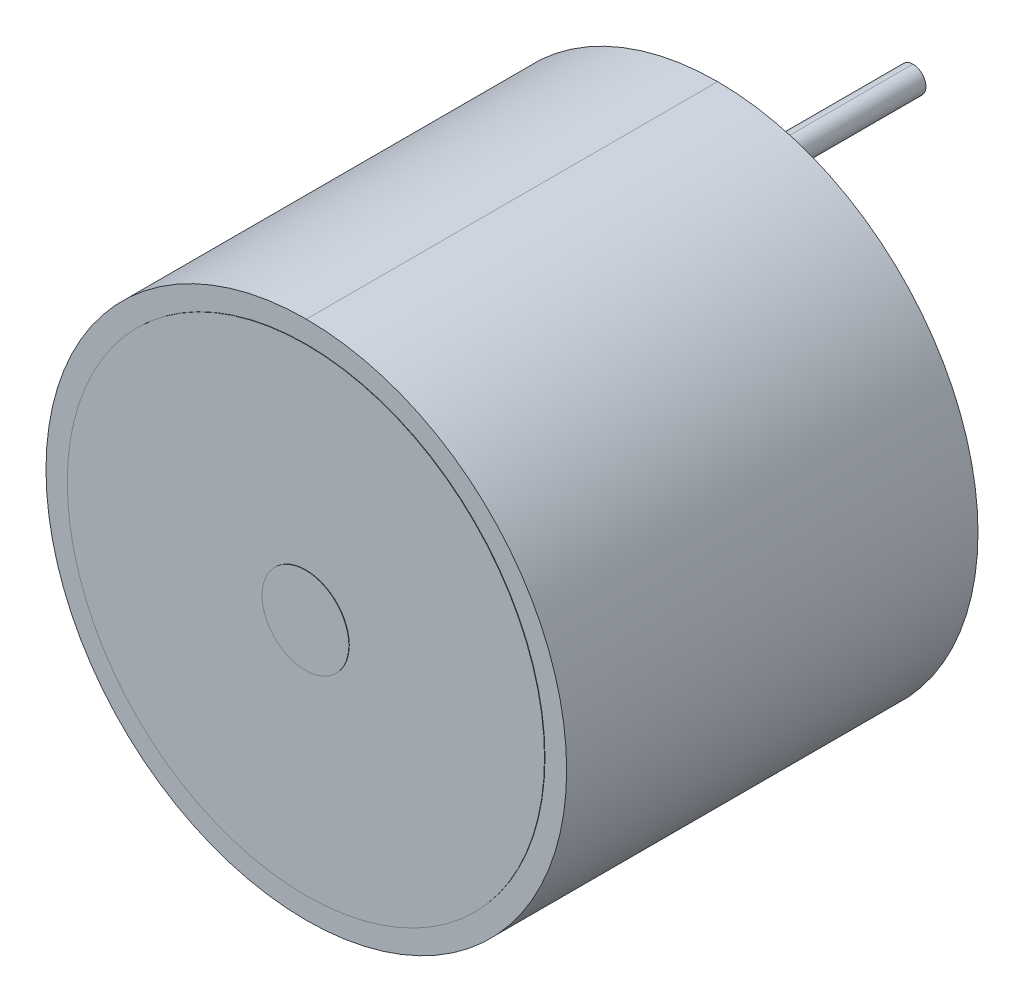
ISO-10303-21;
HEADER;
FILE_DESCRIPTION(('STEP AP214'),'2;1');
FILE_NAME('part.step','',(''),(''),'','','');
FILE_SCHEMA(('AUTOMOTIVE_DESIGN { 1 0 10303 214 1 1 1 1 }'));
ENDSEC;
DATA;
#1=APPLICATION_CONTEXT('core data for automotive mechanical design processes');
#2=APPLICATION_PROTOCOL_DEFINITION('international standard','automotive_design',2000,#1);
#3=PRODUCT_CONTEXT('',#1,'mechanical');
#4=PRODUCT('Part','Part','',(#3));
#5=PRODUCT_RELATED_PRODUCT_CATEGORY('part','',(#4));
#6=PRODUCT_DEFINITION_FORMATION('','',#4);
#7=PRODUCT_DEFINITION_CONTEXT('part definition',#1,'design');
#8=PRODUCT_DEFINITION('design','',#6,#7);
#9=PRODUCT_DEFINITION_SHAPE('','',#8);
#10=(LENGTH_UNIT() NAMED_UNIT(*) SI_UNIT(.MILLI.,.METRE.));
#11=(NAMED_UNIT(*) PLANE_ANGLE_UNIT() SI_UNIT($,.RADIAN.));
#12=(NAMED_UNIT(*) SI_UNIT($,.STERADIAN.) SOLID_ANGLE_UNIT());
#13=UNCERTAINTY_MEASURE_WITH_UNIT(LENGTH_MEASURE(1.E-05),#10,'distance_accuracy_value','');
#14=(GEOMETRIC_REPRESENTATION_CONTEXT(3) GLOBAL_UNCERTAINTY_ASSIGNED_CONTEXT((#13)) GLOBAL_UNIT_ASSIGNED_CONTEXT((#10,
#11,#12)) REPRESENTATION_CONTEXT('',''));
#15=CARTESIAN_POINT('',(0.,0.,0.));
#16=DIRECTION('',(0.,0.,1.));
#17=DIRECTION('',(1.,0.,0.));
#18=AXIS2_PLACEMENT_3D('',#15,#16,#17);
#19=CARTESIAN_POINT('',(0.,0.,0.02));
#20=DIRECTION('',(0.,0.,-1.));
#21=DIRECTION('',(1.,0.,0.));
#22=AXIS2_PLACEMENT_3D('',#19,#20,#21);
#23=CYLINDRICAL_SURFACE('',#22,5.5);
#24=CARTESIAN_POINT('',(0.,0.,0.02));
#25=DIRECTION('',(0.,0.,1.));
#26=DIRECTION('',(1.,0.,0.));
#27=AXIS2_PLACEMENT_3D('',#24,#25,#26);
#28=CIRCLE('',#27,5.5);
#29=CARTESIAN_POINT('',(0.,5.5,0.02));
#30=VERTEX_POINT('',#29);
#31=CARTESIAN_POINT('',(0.,-5.5,0.02));
#32=VERTEX_POINT('',#31);
#33=EDGE_CURVE('P0_E11',#30,#32,#28,.T.);
#34=ORIENTED_EDGE('',*,*,#33,.T.);
#35=DIRECTION('',(0.,0.,1.));
#36=VECTOR('',#35,1.);
#37=CARTESIAN_POINT('',(0.,-5.5,0.02));
#38=LINE('',#37,#36);
#39=CARTESIAN_POINT('',(0.,-5.5,9.49));
#40=VERTEX_POINT('',#39);
#41=EDGE_CURVE('P0_E23',#32,#40,#38,.T.);
#42=ORIENTED_EDGE('',*,*,#41,.T.);
#43=CARTESIAN_POINT('',(0.,0.,9.49));
#44=DIRECTION('',(0.,0.,1.));
#45=DIRECTION('',(1.,0.,0.));
#46=AXIS2_PLACEMENT_3D('',#43,#44,#45);
#47=CIRCLE('',#46,5.5);
#48=CARTESIAN_POINT('',(0.,5.5,9.49));
#49=VERTEX_POINT('',#48);
#50=EDGE_CURVE('P0_E38',#49,#40,#47,.T.);
#51=ORIENTED_EDGE('',*,*,#50,.F.);
#52=DIRECTION('',(0.,0.,1.));
#53=VECTOR('',#52,1.);
#54=CARTESIAN_POINT('',(0.,5.5,0.02));
#55=LINE('',#54,#53);
#56=EDGE_CURVE('P0_E40',#30,#49,#55,.T.);
#57=ORIENTED_EDGE('',*,*,#56,.F.);
#58=EDGE_LOOP('',(#34,#42,#51,#57));
#59=FACE_BOUND('',#58,.T.);
#60=ADVANCED_FACE('P0_F16',(#59),#23,.T.);
#61=CARTESIAN_POINT('',(0.,0.,0.02));
#62=DIRECTION('',(0.,0.,-1.));
#63=DIRECTION('',(1.,0.,0.));
#64=AXIS2_PLACEMENT_3D('',#61,#62,#63);
#65=CYLINDRICAL_SURFACE('',#64,5.5);
#66=CARTESIAN_POINT('',(0.,0.,0.02));
#67=DIRECTION('',(0.,0.,1.));
#68=DIRECTION('',(1.,0.,0.));
#69=AXIS2_PLACEMENT_3D('',#66,#67,#68);
#70=CIRCLE('',#69,5.5);
#71=EDGE_CURVE('P0_E49',#32,#30,#70,.T.);
#72=ORIENTED_EDGE('',*,*,#71,.T.);
#73=ORIENTED_EDGE('',*,*,#56,.T.);
#74=CARTESIAN_POINT('',(0.,0.,9.49));
#75=DIRECTION('',(0.,0.,1.));
#76=DIRECTION('',(1.,0.,0.));
#77=AXIS2_PLACEMENT_3D('',#74,#75,#76);
#78=CIRCLE('',#77,5.5);
#79=EDGE_CURVE('P0_E48',#40,#49,#78,.T.);
#80=ORIENTED_EDGE('',*,*,#79,.F.);
#81=ORIENTED_EDGE('',*,*,#41,.F.);
#82=EDGE_LOOP('',(#72,#73,#80,#81));
#83=FACE_BOUND('',#82,.T.);
#84=ADVANCED_FACE('P0_F47',(#83),#65,.T.);
#85=CARTESIAN_POINT('',(0.,0.,0.02));
#86=DIRECTION('',(0.,0.,1.));
#87=DIRECTION('',(0.,1.,0.));
#88=AXIS2_PLACEMENT_3D('',#85,#86,#87);
#89=PLANE('',#88);
#90=ORIENTED_EDGE('',*,*,#71,.F.);
#91=ORIENTED_EDGE('',*,*,#33,.F.);
#92=EDGE_LOOP('',(#90,#91));
#93=FACE_BOUND('',#92,.T.);
#94=ADVANCED_FACE('P0_F55',(#93),#89,.F.);
#95=CARTESIAN_POINT('',(0.,0.,9.49));
#96=DIRECTION('',(0.,0.,1.));
#97=DIRECTION('',(0.,1.,0.));
#98=AXIS2_PLACEMENT_3D('',#95,#96,#97);
#99=PLANE('',#98);
#100=ORIENTED_EDGE('',*,*,#50,.T.);
#101=ORIENTED_EDGE('',*,*,#79,.T.);
#102=EDGE_LOOP('',(#100,#101));
#103=FACE_BOUND('',#102,.T.);
#104=ADVANCED_FACE('P0_F51',(#103),#99,.T.);
#105=CLOSED_SHELL('',(#60,#84,#94,#104));
#106=MANIFOLD_SOLID_BREP('P0_B1',#105);
#107=CARTESIAN_POINT('',(0.,3.8,-4.5));
#108=DIRECTION('',(0.,0.,-1.));
#109=DIRECTION('',(1.,0.,0.));
#110=AXIS2_PLACEMENT_3D('',#107,#108,#109);
#111=CYLINDRICAL_SURFACE('',#110,0.3);
#112=CARTESIAN_POINT('',(0.,3.8,-4.5));
#113=DIRECTION('',(0.,0.,1.));
#114=DIRECTION('',(1.,0.,0.));
#115=AXIS2_PLACEMENT_3D('',#112,#113,#114);
#116=CIRCLE('',#115,0.3);
#117=CARTESIAN_POINT('',(0.,4.1,-4.5));
#118=VERTEX_POINT('',#117);
#119=CARTESIAN_POINT('',(0.,3.5,-4.5));
#120=VERTEX_POINT('',#119);
#121=EDGE_CURVE('P1_E11',#118,#120,#116,.T.);
#122=ORIENTED_EDGE('',*,*,#121,.T.);
#123=DIRECTION('',(0.,0.,1.));
#124=VECTOR('',#123,1.);
#125=CARTESIAN_POINT('',(0.,3.5,-4.5));
#126=LINE('',#125,#124);
#127=CARTESIAN_POINT('',(0.,3.5,0.));
#128=VERTEX_POINT('',#127);
#129=EDGE_CURVE('P1_E23',#120,#128,#126,.T.);
#130=ORIENTED_EDGE('',*,*,#129,.T.);
#131=CARTESIAN_POINT('',(0.,3.8,0.));
#132=DIRECTION('',(0.,0.,1.));
#133=DIRECTION('',(1.,0.,0.));
#134=AXIS2_PLACEMENT_3D('',#131,#132,#133);
#135=CIRCLE('',#134,0.3);
#136=CARTESIAN_POINT('',(0.,4.1,0.));
#137=VERTEX_POINT('',#136);
#138=EDGE_CURVE('P1_E38',#137,#128,#135,.T.);
#139=ORIENTED_EDGE('',*,*,#138,.F.);
#140=DIRECTION('',(0.,0.,1.));
#141=VECTOR('',#140,1.);
#142=CARTESIAN_POINT('',(0.,4.1,-4.5));
#143=LINE('',#142,#141);
#144=EDGE_CURVE('P1_E40',#118,#137,#143,.T.);
#145=ORIENTED_EDGE('',*,*,#144,.F.);
#146=EDGE_LOOP('',(#122,#130,#139,#145));
#147=FACE_BOUND('',#146,.T.);
#148=ADVANCED_FACE('P1_F16',(#147),#111,.T.);
#149=CARTESIAN_POINT('',(0.,3.8,-4.5));
#150=DIRECTION('',(0.,0.,-1.));
#151=DIRECTION('',(1.,0.,0.));
#152=AXIS2_PLACEMENT_3D('',#149,#150,#151);
#153=CYLINDRICAL_SURFACE('',#152,0.3);
#154=CARTESIAN_POINT('',(0.,3.8,-4.5));
#155=DIRECTION('',(0.,0.,1.));
#156=DIRECTION('',(1.,0.,0.));
#157=AXIS2_PLACEMENT_3D('',#154,#155,#156);
#158=CIRCLE('',#157,0.3);
#159=EDGE_CURVE('P1_E49',#120,#118,#158,.T.);
#160=ORIENTED_EDGE('',*,*,#159,.T.);
#161=ORIENTED_EDGE('',*,*,#144,.T.);
#162=CARTESIAN_POINT('',(0.,3.8,0.));
#163=DIRECTION('',(0.,0.,1.));
#164=DIRECTION('',(1.,0.,0.));
#165=AXIS2_PLACEMENT_3D('',#162,#163,#164);
#166=CIRCLE('',#165,0.3);
#167=EDGE_CURVE('P1_E48',#128,#137,#166,.T.);
#168=ORIENTED_EDGE('',*,*,#167,.F.);
#169=ORIENTED_EDGE('',*,*,#129,.F.);
#170=EDGE_LOOP('',(#160,#161,#168,#169));
#171=FACE_BOUND('',#170,.T.);
#172=ADVANCED_FACE('P1_F47',(#171),#153,.T.);
#173=CARTESIAN_POINT('',(0.,3.8,-4.5));
#174=DIRECTION('',(0.,0.,1.));
#175=DIRECTION('',(1.,0.,0.));
#176=AXIS2_PLACEMENT_3D('',#173,#174,#175);
#177=PLANE('',#176);
#178=ORIENTED_EDGE('',*,*,#159,.F.);
#179=ORIENTED_EDGE('',*,*,#121,.F.);
#180=EDGE_LOOP('',(#178,#179));
#181=FACE_BOUND('',#180,.T.);
#182=ADVANCED_FACE('P1_F55',(#181),#177,.F.);
#183=CARTESIAN_POINT('',(0.,3.8,0.));
#184=DIRECTION('',(0.,0.,1.));
#185=DIRECTION('',(1.,0.,0.));
#186=AXIS2_PLACEMENT_3D('',#183,#184,#185);
#187=PLANE('',#186);
#188=ORIENTED_EDGE('',*,*,#138,.T.);
#189=ORIENTED_EDGE('',*,*,#167,.T.);
#190=EDGE_LOOP('',(#188,#189));
#191=FACE_BOUND('',#190,.T.);
#192=ADVANCED_FACE('P1_F51',(#191),#187,.T.);
#193=CLOSED_SHELL('',(#148,#172,#182,#192));
#194=MANIFOLD_SOLID_BREP('P1_B1',#193);
#195=CARTESIAN_POINT('',(0.,-3.8,-4.5));
#196=DIRECTION('',(0.,0.,-1.));
#197=DIRECTION('',(1.,0.,0.));
#198=AXIS2_PLACEMENT_3D('',#195,#196,#197);
#199=CYLINDRICAL_SURFACE('',#198,0.3);
#200=CARTESIAN_POINT('',(0.,-3.8,-4.5));
#201=DIRECTION('',(0.,0.,1.));
#202=DIRECTION('',(1.,0.,0.));
#203=AXIS2_PLACEMENT_3D('',#200,#201,#202);
#204=CIRCLE('',#203,0.3);
#205=CARTESIAN_POINT('',(0.,-4.1,-4.5));
#206=VERTEX_POINT('',#205);
#207=CARTESIAN_POINT('',(0.,-3.5,-4.5));
#208=VERTEX_POINT('',#207);
#209=EDGE_CURVE('P2_E11',#206,#208,#204,.T.);
#210=ORIENTED_EDGE('',*,*,#209,.T.);
#211=DIRECTION('',(0.,0.,1.));
#212=VECTOR('',#211,1.);
#213=CARTESIAN_POINT('',(0.,-3.5,-4.5));
#214=LINE('',#213,#212);
#215=CARTESIAN_POINT('',(0.,-3.5,0.));
#216=VERTEX_POINT('',#215);
#217=EDGE_CURVE('P2_E23',#208,#216,#214,.T.);
#218=ORIENTED_EDGE('',*,*,#217,.T.);
#219=CARTESIAN_POINT('',(0.,-3.8,0.));
#220=DIRECTION('',(0.,0.,1.));
#221=DIRECTION('',(1.,0.,0.));
#222=AXIS2_PLACEMENT_3D('',#219,#220,#221);
#223=CIRCLE('',#222,0.3);
#224=CARTESIAN_POINT('',(0.,-4.1,0.));
#225=VERTEX_POINT('',#224);
#226=EDGE_CURVE('P2_E38',#225,#216,#223,.T.);
#227=ORIENTED_EDGE('',*,*,#226,.F.);
#228=DIRECTION('',(0.,0.,1.));
#229=VECTOR('',#228,1.);
#230=CARTESIAN_POINT('',(0.,-4.1,-4.5));
#231=LINE('',#230,#229);
#232=EDGE_CURVE('P2_E40',#206,#225,#231,.T.);
#233=ORIENTED_EDGE('',*,*,#232,.F.);
#234=EDGE_LOOP('',(#210,#218,#227,#233));
#235=FACE_BOUND('',#234,.T.);
#236=ADVANCED_FACE('P2_F16',(#235),#199,.T.);
#237=CARTESIAN_POINT('',(0.,-3.8,-4.5));
#238=DIRECTION('',(0.,0.,-1.));
#239=DIRECTION('',(1.,0.,0.));
#240=AXIS2_PLACEMENT_3D('',#237,#238,#239);
#241=CYLINDRICAL_SURFACE('',#240,0.3);
#242=CARTESIAN_POINT('',(0.,-3.8,-4.5));
#243=DIRECTION('',(0.,0.,1.));
#244=DIRECTION('',(1.,0.,0.));
#245=AXIS2_PLACEMENT_3D('',#242,#243,#244);
#246=CIRCLE('',#245,0.3);
#247=EDGE_CURVE('P2_E49',#208,#206,#246,.T.);
#248=ORIENTED_EDGE('',*,*,#247,.T.);
#249=ORIENTED_EDGE('',*,*,#232,.T.);
#250=CARTESIAN_POINT('',(0.,-3.8,0.));
#251=DIRECTION('',(0.,0.,1.));
#252=DIRECTION('',(1.,0.,0.));
#253=AXIS2_PLACEMENT_3D('',#250,#251,#252);
#254=CIRCLE('',#253,0.3);
#255=EDGE_CURVE('P2_E48',#216,#225,#254,.T.);
#256=ORIENTED_EDGE('',*,*,#255,.F.);
#257=ORIENTED_EDGE('',*,*,#217,.F.);
#258=EDGE_LOOP('',(#248,#249,#256,#257));
#259=FACE_BOUND('',#258,.T.);
#260=ADVANCED_FACE('P2_F47',(#259),#241,.T.);
#261=CARTESIAN_POINT('',(0.,-3.8,-4.5));
#262=DIRECTION('',(0.,0.,1.));
#263=DIRECTION('',(1.,0.,0.));
#264=AXIS2_PLACEMENT_3D('',#261,#262,#263);
#265=PLANE('',#264);
#266=ORIENTED_EDGE('',*,*,#247,.F.);
#267=ORIENTED_EDGE('',*,*,#209,.F.);
#268=EDGE_LOOP('',(#266,#267));
#269=FACE_BOUND('',#268,.T.);
#270=ADVANCED_FACE('P2_F55',(#269),#265,.F.);
#271=CARTESIAN_POINT('',(0.,-3.8,0.));
#272=DIRECTION('',(0.,0.,1.));
#273=DIRECTION('',(1.,0.,0.));
#274=AXIS2_PLACEMENT_3D('',#271,#272,#273);
#275=PLANE('',#274);
#276=ORIENTED_EDGE('',*,*,#226,.T.);
#277=ORIENTED_EDGE('',*,*,#255,.T.);
#278=EDGE_LOOP('',(#276,#277));
#279=FACE_BOUND('',#278,.T.);
#280=ADVANCED_FACE('P2_F51',(#279),#275,.T.);
#281=CLOSED_SHELL('',(#236,#260,#270,#280));
#282=MANIFOLD_SOLID_BREP('P2_B1',#281);
#283=CARTESIAN_POINT('',(0.,0.,0.));
#284=DIRECTION('',(0.,0.,-1.));
#285=DIRECTION('',(1.,0.,0.));
#286=AXIS2_PLACEMENT_3D('',#283,#284,#285);
#287=CYLINDRICAL_SURFACE('',#286,6.);
#288=CARTESIAN_POINT('',(0.,0.,0.));
#289=DIRECTION('',(0.,0.,1.));
#290=DIRECTION('',(1.,0.,0.));
#291=AXIS2_PLACEMENT_3D('',#288,#289,#290);
#292=CIRCLE('',#291,6.);
#293=CARTESIAN_POINT('',(0.,-6.,0.));
#294=VERTEX_POINT('',#293);
#295=CARTESIAN_POINT('',(0.,6.,0.));
#296=VERTEX_POINT('',#295);
#297=EDGE_CURVE('P3_E11',#294,#296,#292,.T.);
#298=ORIENTED_EDGE('',*,*,#297,.T.);
#299=DIRECTION('',(0.,0.,1.));
#300=VECTOR('',#299,1.);
#301=CARTESIAN_POINT('',(0.,6.,0.));
#302=LINE('',#301,#300);
#303=CARTESIAN_POINT('',(0.,6.,9.48));
#304=VERTEX_POINT('',#303);
#305=EDGE_CURVE('P3_E23',#296,#304,#302,.T.);
#306=ORIENTED_EDGE('',*,*,#305,.T.);
#307=CARTESIAN_POINT('',(0.,0.,9.48));
#308=DIRECTION('',(0.,0.,1.));
#309=DIRECTION('',(1.,0.,0.));
#310=AXIS2_PLACEMENT_3D('',#307,#308,#309);
#311=CIRCLE('',#310,6.);
#312=CARTESIAN_POINT('',(0.,-6.,9.48));
#313=VERTEX_POINT('',#312);
#314=EDGE_CURVE('P3_E38',#313,#304,#311,.T.);
#315=ORIENTED_EDGE('',*,*,#314,.F.);
#316=DIRECTION('',(0.,0.,1.));
#317=VECTOR('',#316,1.);
#318=CARTESIAN_POINT('',(0.,-6.,0.));
#319=LINE('',#318,#317);
#320=EDGE_CURVE('P3_E40',#294,#313,#319,.T.);
#321=ORIENTED_EDGE('',*,*,#320,.F.);
#322=EDGE_LOOP('',(#298,#306,#315,#321));
#323=FACE_BOUND('',#322,.T.);
#324=ADVANCED_FACE('P3_F16',(#323),#287,.T.);
#325=CARTESIAN_POINT('',(0.,0.,0.));
#326=DIRECTION('',(0.,0.,-1.));
#327=DIRECTION('',(1.,0.,0.));
#328=AXIS2_PLACEMENT_3D('',#325,#326,#327);
#329=CYLINDRICAL_SURFACE('',#328,6.);
#330=CARTESIAN_POINT('',(0.,0.,0.));
#331=DIRECTION('',(0.,0.,1.));
#332=DIRECTION('',(1.,0.,0.));
#333=AXIS2_PLACEMENT_3D('',#330,#331,#332);
#334=CIRCLE('',#333,6.);
#335=EDGE_CURVE('P3_E49',#296,#294,#334,.T.);
#336=ORIENTED_EDGE('',*,*,#335,.T.);
#337=ORIENTED_EDGE('',*,*,#320,.T.);
#338=CARTESIAN_POINT('',(0.,0.,9.48));
#339=DIRECTION('',(0.,0.,1.));
#340=DIRECTION('',(1.,0.,0.));
#341=AXIS2_PLACEMENT_3D('',#338,#339,#340);
#342=CIRCLE('',#341,6.);
#343=EDGE_CURVE('P3_E48',#304,#313,#342,.T.);
#344=ORIENTED_EDGE('',*,*,#343,.F.);
#345=ORIENTED_EDGE('',*,*,#305,.F.);
#346=EDGE_LOOP('',(#336,#337,#344,#345));
#347=FACE_BOUND('',#346,.T.);
#348=ADVANCED_FACE('P3_F47',(#347),#329,.T.);
#349=CARTESIAN_POINT('',(0.,0.,0.));
#350=DIRECTION('',(0.,0.,1.));
#351=DIRECTION('',(1.,0.,0.));
#352=AXIS2_PLACEMENT_3D('',#349,#350,#351);
#353=PLANE('',#352);
#354=ORIENTED_EDGE('',*,*,#335,.F.);
#355=ORIENTED_EDGE('',*,*,#297,.F.);
#356=EDGE_LOOP('',(#354,#355));
#357=FACE_BOUND('',#356,.T.);
#358=ADVANCED_FACE('P3_F55',(#357),#353,.F.);
#359=CARTESIAN_POINT('',(0.,0.,9.48));
#360=DIRECTION('',(0.,0.,1.));
#361=DIRECTION('',(1.,0.,0.));
#362=AXIS2_PLACEMENT_3D('',#359,#360,#361);
#363=PLANE('',#362);
#364=ORIENTED_EDGE('',*,*,#314,.T.);
#365=ORIENTED_EDGE('',*,*,#343,.T.);
#366=EDGE_LOOP('',(#364,#365));
#367=FACE_BOUND('',#366,.T.);
#368=ADVANCED_FACE('P3_F51',(#367),#363,.T.);
#369=CLOSED_SHELL('',(#324,#348,#358,#368));
#370=MANIFOLD_SOLID_BREP('P3_B1',#369);
#371=CARTESIAN_POINT('',(0.,0.,0.));
#372=DIRECTION('',(0.,0.,-1.));
#373=DIRECTION('',(1.,0.,0.));
#374=AXIS2_PLACEMENT_3D('',#371,#372,#373);
#375=CYLINDRICAL_SURFACE('',#374,1.);
#376=CARTESIAN_POINT('',(0.,0.,0.));
#377=DIRECTION('',(0.,0.,1.));
#378=DIRECTION('',(1.,0.,0.));
#379=AXIS2_PLACEMENT_3D('',#376,#377,#378);
#380=CIRCLE('',#379,1.);
#381=CARTESIAN_POINT('',(0.,1.,0.));
#382=VERTEX_POINT('',#381);
#383=CARTESIAN_POINT('',(0.,-1.,0.));
#384=VERTEX_POINT('',#383);
#385=EDGE_CURVE('P4_E11',#382,#384,#380,.T.);
#386=ORIENTED_EDGE('',*,*,#385,.T.);
#387=DIRECTION('',(0.,0.,1.));
#388=VECTOR('',#387,1.);
#389=CARTESIAN_POINT('',(0.,-1.,0.));
#390=LINE('',#389,#388);
#391=CARTESIAN_POINT('',(0.,-1.,9.5));
#392=VERTEX_POINT('',#391);
#393=EDGE_CURVE('P4_E23',#384,#392,#390,.T.);
#394=ORIENTED_EDGE('',*,*,#393,.T.);
#395=CARTESIAN_POINT('',(0.,0.,9.5));
#396=DIRECTION('',(0.,0.,1.));
#397=DIRECTION('',(1.,0.,0.));
#398=AXIS2_PLACEMENT_3D('',#395,#396,#397);
#399=CIRCLE('',#398,1.);
#400=CARTESIAN_POINT('',(0.,1.,9.5));
#401=VERTEX_POINT('',#400);
#402=EDGE_CURVE('P4_E45',#401,#392,#399,.T.);
#403=ORIENTED_EDGE('',*,*,#402,.F.);
#404=DIRECTION('',(0.,0.,1.));
#405=VECTOR('',#404,1.);
#406=CARTESIAN_POINT('',(0.,1.,0.));
#407=LINE('',#406,#405);
#408=EDGE_CURVE('P4_E33',#382,#401,#407,.T.);
#409=ORIENTED_EDGE('',*,*,#408,.F.);
#410=EDGE_LOOP('',(#386,#394,#403,#409));
#411=FACE_BOUND('',#410,.T.);
#412=ADVANCED_FACE('P4_F16',(#411),#375,.T.);
#413=CARTESIAN_POINT('',(0.,0.,0.));
#414=DIRECTION('',(0.,0.,-1.));
#415=DIRECTION('',(1.,0.,0.));
#416=AXIS2_PLACEMENT_3D('',#413,#414,#415);
#417=CYLINDRICAL_SURFACE('',#416,1.);
#418=CARTESIAN_POINT('',(0.,0.,0.));
#419=DIRECTION('',(0.,0.,1.));
#420=DIRECTION('',(1.,0.,0.));
#421=AXIS2_PLACEMENT_3D('',#418,#419,#420);
#422=CIRCLE('',#421,1.);
#423=EDGE_CURVE('P4_E44',#384,#382,#422,.T.);
#424=ORIENTED_EDGE('',*,*,#423,.T.);
#425=ORIENTED_EDGE('',*,*,#408,.T.);
#426=CARTESIAN_POINT('',(0.,0.,9.5));
#427=DIRECTION('',(0.,0.,1.));
#428=DIRECTION('',(1.,0.,0.));
#429=AXIS2_PLACEMENT_3D('',#426,#427,#428);
#430=CIRCLE('',#429,1.);
#431=EDGE_CURVE('P4_E43',#392,#401,#430,.T.);
#432=ORIENTED_EDGE('',*,*,#431,.F.);
#433=ORIENTED_EDGE('',*,*,#393,.F.);
#434=EDGE_LOOP('',(#424,#425,#432,#433));
#435=FACE_BOUND('',#434,.T.);
#436=ADVANCED_FACE('P4_F41',(#435),#417,.T.);
#437=CARTESIAN_POINT('',(0.,0.,0.));
#438=DIRECTION('',(0.,0.,1.));
#439=DIRECTION('',(1.,0.,0.));
#440=AXIS2_PLACEMENT_3D('',#437,#438,#439);
#441=PLANE('',#440);
#442=ORIENTED_EDGE('',*,*,#423,.F.);
#443=ORIENTED_EDGE('',*,*,#385,.F.);
#444=EDGE_LOOP('',(#442,#443));
#445=FACE_BOUND('',#444,.T.);
#446=ADVANCED_FACE('P4_F58',(#445),#441,.F.);
#447=CARTESIAN_POINT('',(0.,0.,9.5));
#448=DIRECTION('',(0.,0.,1.));
#449=DIRECTION('',(1.,0.,0.));
#450=AXIS2_PLACEMENT_3D('',#447,#448,#449);
#451=PLANE('',#450);
#452=ORIENTED_EDGE('',*,*,#402,.T.);
#453=ORIENTED_EDGE('',*,*,#431,.T.);
#454=EDGE_LOOP('',(#452,#453));
#455=FACE_BOUND('',#454,.T.);
#456=ADVANCED_FACE('P4_F49',(#455),#451,.T.);
#457=CLOSED_SHELL('',(#412,#436,#446,#456));
#458=MANIFOLD_SOLID_BREP('P4_B1',#457);
#459=ADVANCED_BREP_SHAPE_REPRESENTATION('',(#18,#106,#194,#282,#370,#458),#14);
#460=SHAPE_DEFINITION_REPRESENTATION(#9,#459);
ENDSEC;
END-ISO-10303-21;
